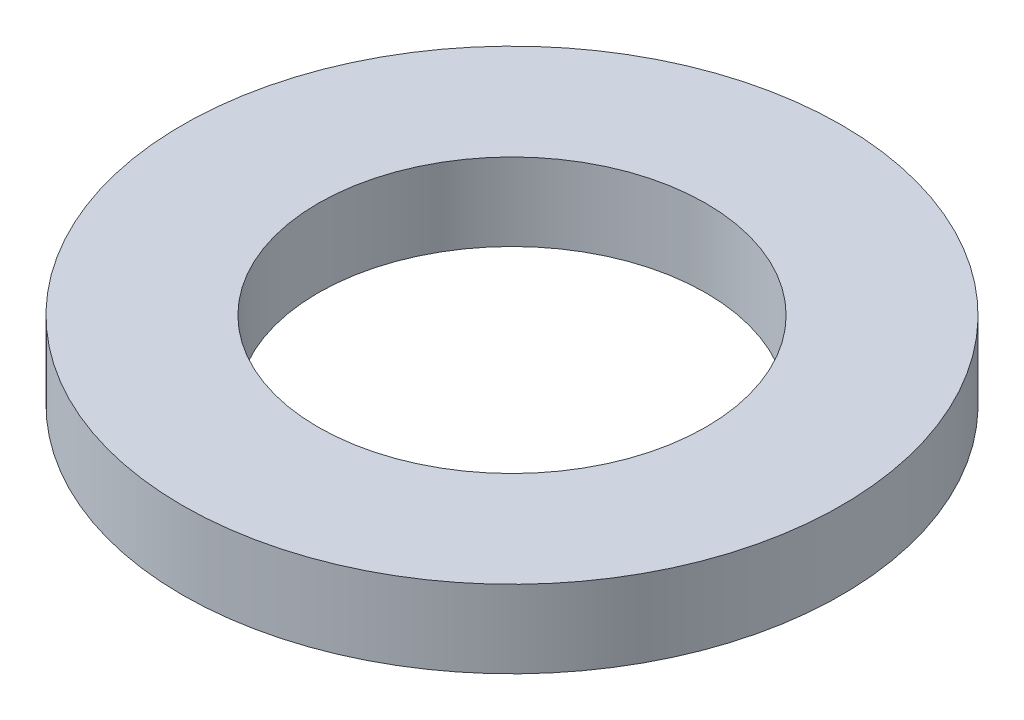
ISO-10303-21;
HEADER;
FILE_DESCRIPTION(('STEP AP214'),'2;1');
FILE_NAME('part.step','',(''),(''),'','','');
FILE_SCHEMA(('AUTOMOTIVE_DESIGN { 1 0 10303 214 1 1 1 1 }'));
ENDSEC;
DATA;
#1=APPLICATION_CONTEXT('core data for automotive mechanical design processes');
#2=APPLICATION_PROTOCOL_DEFINITION('international standard','automotive_design',2000,#1);
#3=PRODUCT_CONTEXT('',#1,'mechanical');
#4=PRODUCT('Part','Part','',(#3));
#5=PRODUCT_RELATED_PRODUCT_CATEGORY('part','',(#4));
#6=PRODUCT_DEFINITION_FORMATION('','',#4);
#7=PRODUCT_DEFINITION_CONTEXT('part definition',#1,'design');
#8=PRODUCT_DEFINITION('design','',#6,#7);
#9=PRODUCT_DEFINITION_SHAPE('','',#8);
#10=(LENGTH_UNIT() NAMED_UNIT(*) SI_UNIT(.MILLI.,.METRE.));
#11=(NAMED_UNIT(*) PLANE_ANGLE_UNIT() SI_UNIT($,.RADIAN.));
#12=(NAMED_UNIT(*) SI_UNIT($,.STERADIAN.) SOLID_ANGLE_UNIT());
#13=UNCERTAINTY_MEASURE_WITH_UNIT(LENGTH_MEASURE(1.E-05),#10,'distance_accuracy_value','');
#14=(GEOMETRIC_REPRESENTATION_CONTEXT(3) GLOBAL_UNCERTAINTY_ASSIGNED_CONTEXT((#13)) GLOBAL_UNIT_ASSIGNED_CONTEXT((#10,
#11,#12)) REPRESENTATION_CONTEXT('',''));
#15=CARTESIAN_POINT('',(0.,0.,0.));
#16=DIRECTION('',(0.,0.,1.));
#17=DIRECTION('',(1.,0.,0.));
#18=AXIS2_PLACEMENT_3D('',#15,#16,#17);
#19=CARTESIAN_POINT('',(0.,3.,0.));
#20=DIRECTION('',(0.,1.,0.));
#21=DIRECTION('',(0.,0.,1.));
#22=AXIS2_PLACEMENT_3D('',#19,#20,#21);
#23=PLANE('',#22);
#24=CARTESIAN_POINT('',(0.,3.,0.));
#25=DIRECTION('',(0.,1.,0.));
#26=DIRECTION('',(0.,0.,1.));
#27=AXIS2_PLACEMENT_3D('',#24,#25,#26);
#28=CIRCLE('',#27,12.75);
#29=CARTESIAN_POINT('',(0.,3.,12.75));
#30=VERTEX_POINT('',#29);
#31=EDGE_CURVE('E10',#30,#30,#28,.T.);
#32=ORIENTED_EDGE('',*,*,#31,.T.);
#33=EDGE_LOOP('',(#32));
#34=FACE_BOUND('',#33,.T.);
#35=CARTESIAN_POINT('',(0.,3.,0.));
#36=DIRECTION('',(0.,1.,0.));
#37=DIRECTION('',(0.,0.,1.));
#38=AXIS2_PLACEMENT_3D('',#35,#36,#37);
#39=CIRCLE('',#38,7.5);
#40=CARTESIAN_POINT('',(0.,3.,7.5));
#41=VERTEX_POINT('',#40);
#42=EDGE_CURVE('E42',#41,#41,#39,.T.);
#43=ORIENTED_EDGE('',*,*,#42,.F.);
#44=EDGE_LOOP('',(#43));
#45=FACE_BOUND('',#44,.T.);
#46=ADVANCED_FACE('F31',(#34,#45),#23,.T.);
#47=CARTESIAN_POINT('',(0.,0.,0.));
#48=DIRECTION('',(0.,1.,0.));
#49=DIRECTION('',(0.,0.,1.));
#50=AXIS2_PLACEMENT_3D('',#47,#48,#49);
#51=PLANE('',#50);
#52=CARTESIAN_POINT('',(0.,0.,0.));
#53=DIRECTION('',(0.,1.,0.));
#54=DIRECTION('',(0.,0.,1.));
#55=AXIS2_PLACEMENT_3D('',#52,#53,#54);
#56=CIRCLE('',#55,12.75);
#57=CARTESIAN_POINT('',(0.,0.,12.75));
#58=VERTEX_POINT('',#57);
#59=EDGE_CURVE('E35',#58,#58,#56,.T.);
#60=ORIENTED_EDGE('',*,*,#59,.F.);
#61=EDGE_LOOP('',(#60));
#62=FACE_BOUND('',#61,.T.);
#63=CARTESIAN_POINT('',(0.,0.,0.));
#64=DIRECTION('',(0.,1.,0.));
#65=DIRECTION('',(0.,0.,1.));
#66=AXIS2_PLACEMENT_3D('',#63,#64,#65);
#67=CIRCLE('',#66,7.5);
#68=CARTESIAN_POINT('',(0.,0.,7.5));
#69=VERTEX_POINT('',#68);
#70=EDGE_CURVE('E44',#69,#69,#67,.T.);
#71=ORIENTED_EDGE('',*,*,#70,.T.);
#72=EDGE_LOOP('',(#71));
#73=FACE_BOUND('',#72,.T.);
#74=ADVANCED_FACE('F54',(#62,#73),#51,.F.);
#75=CARTESIAN_POINT('',(0.,3.,0.));
#76=DIRECTION('',(0.,-1.,0.));
#77=DIRECTION('',(0.,0.,-1.));
#78=AXIS2_PLACEMENT_3D('',#75,#76,#77);
#79=CYLINDRICAL_SURFACE('',#78,12.75);
#80=ORIENTED_EDGE('',*,*,#31,.F.);
#81=EDGE_LOOP('',(#80));
#82=FACE_BOUND('',#81,.T.);
#83=ORIENTED_EDGE('',*,*,#59,.T.);
#84=EDGE_LOOP('',(#83));
#85=FACE_BOUND('',#84,.T.);
#86=ADVANCED_FACE('F33',(#82,#85),#79,.T.);
#87=CARTESIAN_POINT('',(0.,3.,0.));
#88=DIRECTION('',(0.,-1.,0.));
#89=DIRECTION('',(0.,0.,-1.));
#90=AXIS2_PLACEMENT_3D('',#87,#88,#89);
#91=CYLINDRICAL_SURFACE('',#90,7.5);
#92=ORIENTED_EDGE('',*,*,#42,.T.);
#93=EDGE_LOOP('',(#92));
#94=FACE_BOUND('',#93,.T.);
#95=ORIENTED_EDGE('',*,*,#70,.F.);
#96=EDGE_LOOP('',(#95));
#97=FACE_BOUND('',#96,.T.);
#98=ADVANCED_FACE('F50',(#94,#97),#91,.F.);
#99=CLOSED_SHELL('',(#46,#74,#86,#98));
#100=MANIFOLD_SOLID_BREP('B2',#99);
#101=ADVANCED_BREP_SHAPE_REPRESENTATION('',(#18,#100),#14);
#102=SHAPE_DEFINITION_REPRESENTATION(#9,#101);
ENDSEC;
END-ISO-10303-21;
